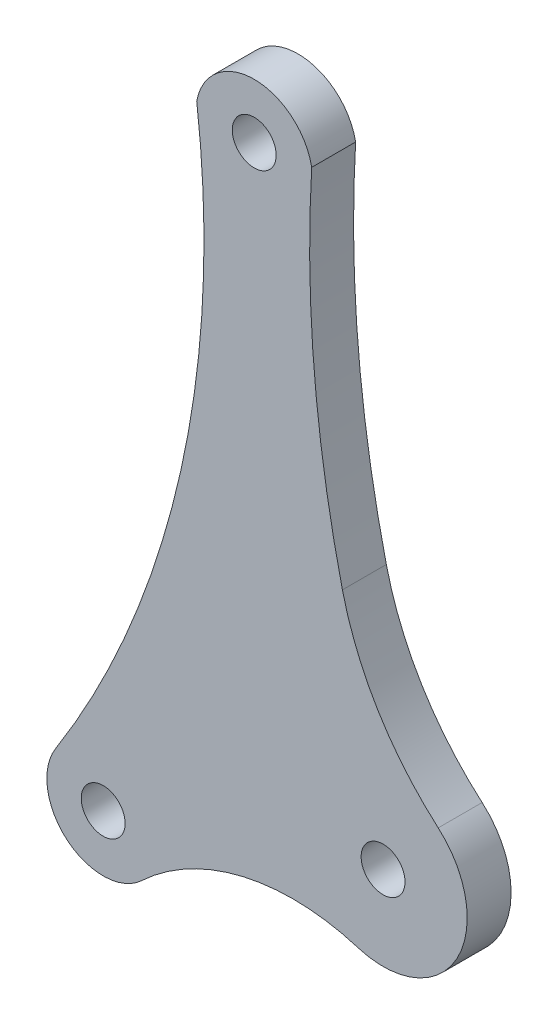
ISO-10303-21;
HEADER;
FILE_DESCRIPTION(('STEP AP214'),'2;1');
FILE_NAME('part.step','',(''),(''),'','','');
FILE_SCHEMA(('AUTOMOTIVE_DESIGN { 1 0 10303 214 1 1 1 1 }'));
ENDSEC;
DATA;
#1=APPLICATION_CONTEXT('core data for automotive mechanical design processes');
#2=APPLICATION_PROTOCOL_DEFINITION('international standard','automotive_design',2000,#1);
#3=PRODUCT_CONTEXT('',#1,'mechanical');
#4=PRODUCT('Part','Part','',(#3));
#5=PRODUCT_RELATED_PRODUCT_CATEGORY('part','',(#4));
#6=PRODUCT_DEFINITION_FORMATION('','',#4);
#7=PRODUCT_DEFINITION_CONTEXT('part definition',#1,'design');
#8=PRODUCT_DEFINITION('design','',#6,#7);
#9=PRODUCT_DEFINITION_SHAPE('','',#8);
#10=(LENGTH_UNIT() NAMED_UNIT(*) SI_UNIT(.MILLI.,.METRE.));
#11=(NAMED_UNIT(*) PLANE_ANGLE_UNIT() SI_UNIT($,.RADIAN.));
#12=(NAMED_UNIT(*) SI_UNIT($,.STERADIAN.) SOLID_ANGLE_UNIT());
#13=UNCERTAINTY_MEASURE_WITH_UNIT(LENGTH_MEASURE(1.E-05),#10,'distance_accuracy_value','');
#14=(GEOMETRIC_REPRESENTATION_CONTEXT(3) GLOBAL_UNCERTAINTY_ASSIGNED_CONTEXT((#13)) GLOBAL_UNIT_ASSIGNED_CONTEXT((#10,
#11,#12)) REPRESENTATION_CONTEXT('',''));
#15=CARTESIAN_POINT('',(0.,0.,0.));
#16=DIRECTION('',(0.,0.,1.));
#17=DIRECTION('',(1.,0.,0.));
#18=AXIS2_PLACEMENT_3D('',#15,#16,#17);
#19=CARTESIAN_POINT('',(1201.72344264431,1445.55749163267,-3.));
#20=DIRECTION('',(0.,0.,1.));
#21=DIRECTION('',(1.,0.,0.));
#22=AXIS2_PLACEMENT_3D('',#19,#20,#21);
#23=CYLINDRICAL_SURFACE('',#22,65.7002973868371);
#24=CARTESIAN_POINT('',(1201.72344264431,1445.55749163267,0.));
#25=DIRECTION('',(0.,0.,-1.));
#26=DIRECTION('',(-1.,0.,0.));
#27=AXIS2_PLACEMENT_3D('',#24,#25,#26);
#28=CIRCLE('',#27,65.7002973868371);
#29=CARTESIAN_POINT('',(1266.9250454505,1453.63709980525,0.));
#30=VERTEX_POINT('',#29);
#31=CARTESIAN_POINT('',(1257.27880649141,1410.4842735805,0.));
#32=VERTEX_POINT('',#31);
#33=EDGE_CURVE('E129',#30,#32,#28,.T.);
#34=ORIENTED_EDGE('',*,*,#33,.F.);
#35=DIRECTION('',(0.,0.,1.));
#36=VECTOR('',#35,1.);
#37=CARTESIAN_POINT('',(1266.9250454505,1453.63709980525,-3.));
#38=LINE('',#37,#36);
#39=CARTESIAN_POINT('',(1266.9250454505,1453.63709980525,-3.));
#40=VERTEX_POINT('',#39);
#41=EDGE_CURVE('E11',#40,#30,#38,.T.);
#42=ORIENTED_EDGE('',*,*,#41,.F.);
#43=CARTESIAN_POINT('',(1201.72344264431,1445.55749163267,-3.));
#44=DIRECTION('',(0.,0.,-1.));
#45=DIRECTION('',(-1.,0.,0.));
#46=AXIS2_PLACEMENT_3D('',#43,#44,#45);
#47=CIRCLE('',#46,65.7002973868371);
#48=CARTESIAN_POINT('',(1257.27880649141,1410.4842735805,-3.));
#49=VERTEX_POINT('',#48);
#50=EDGE_CURVE('E147',#40,#49,#47,.T.);
#51=ORIENTED_EDGE('',*,*,#50,.T.);
#52=DIRECTION('',(0.,0.,1.));
#53=VECTOR('',#52,1.);
#54=CARTESIAN_POINT('',(1257.27880649141,1410.4842735805,-3.));
#55=LINE('',#54,#53);
#56=EDGE_CURVE('E41',#49,#32,#55,.T.);
#57=ORIENTED_EDGE('',*,*,#56,.T.);
#58=EDGE_LOOP('',(#34,#42,#51,#57));
#59=FACE_BOUND('',#58,.T.);
#60=ADVANCED_FACE('F38',(#59),#23,.F.);
#61=CARTESIAN_POINT('',(1270.85385847165,1452.88581540847,-3.));
#62=DIRECTION('',(0.,0.,1.));
#63=DIRECTION('',(1.,0.,0.));
#64=AXIS2_PLACEMENT_3D('',#61,#62,#63);
#65=CYLINDRICAL_SURFACE('',#64,3.99999999999996);
#66=CARTESIAN_POINT('',(1270.85385847165,1452.88581540847,0.));
#67=DIRECTION('',(0.,0.,1.));
#68=DIRECTION('',(-1.,0.,0.));
#69=AXIS2_PLACEMENT_3D('',#66,#67,#68);
#70=CIRCLE('',#69,3.99999999999996);
#71=CARTESIAN_POINT('',(1274.7826714928,1453.63709980525,0.));
#72=VERTEX_POINT('',#71);
#73=EDGE_CURVE('E145',#72,#30,#70,.T.);
#74=ORIENTED_EDGE('',*,*,#73,.F.);
#75=DIRECTION('',(0.,0.,1.));
#76=VECTOR('',#75,1.);
#77=CARTESIAN_POINT('',(1274.7826714928,1453.63709980525,-3.));
#78=LINE('',#77,#76);
#79=CARTESIAN_POINT('',(1274.7826714928,1453.63709980525,-3.));
#80=VERTEX_POINT('',#79);
#81=EDGE_CURVE('E47',#80,#72,#78,.T.);
#82=ORIENTED_EDGE('',*,*,#81,.F.);
#83=CARTESIAN_POINT('',(1270.85385847165,1452.88581540847,-3.));
#84=DIRECTION('',(0.,0.,1.));
#85=DIRECTION('',(-1.,0.,0.));
#86=AXIS2_PLACEMENT_3D('',#83,#84,#85);
#87=CIRCLE('',#86,3.99999999999996);
#88=EDGE_CURVE('E119',#80,#40,#87,.T.);
#89=ORIENTED_EDGE('',*,*,#88,.T.);
#90=ORIENTED_EDGE('',*,*,#41,.T.);
#91=EDGE_LOOP('',(#74,#82,#89,#90));
#92=FACE_BOUND('',#91,.T.);
#93=ADVANCED_FACE('F157',(#92),#65,.T.);
#94=CARTESIAN_POINT('',(1357.48955434481,1448.81843434177,-3.));
#95=DIRECTION('',(0.,0.,1.));
#96=DIRECTION('',(1.,0.,0.));
#97=AXIS2_PLACEMENT_3D('',#94,#95,#96);
#98=CYLINDRICAL_SURFACE('',#97,82.8471363895233);
#99=CARTESIAN_POINT('',(1357.48955434481,1448.81843434177,0.));
#100=DIRECTION('',(0.,0.,-1.));
#101=DIRECTION('',(1.,0.,0.));
#102=AXIS2_PLACEMENT_3D('',#99,#100,#101);
#103=CIRCLE('',#102,82.8471363895233);
#104=CARTESIAN_POINT('',(1276.88234074241,1429.68403800425,0.));
#105=VERTEX_POINT('',#104);
#106=EDGE_CURVE('E106',#105,#72,#103,.T.);
#107=ORIENTED_EDGE('',*,*,#106,.F.);
#108=DIRECTION('',(0.,0.,1.));
#109=VECTOR('',#108,1.);
#110=CARTESIAN_POINT('',(1276.88234074241,1429.68403800425,-3.));
#111=LINE('',#110,#109);
#112=CARTESIAN_POINT('',(1276.88234074241,1429.68403800425,-3.));
#113=VERTEX_POINT('',#112);
#114=EDGE_CURVE('E101',#113,#105,#111,.T.);
#115=ORIENTED_EDGE('',*,*,#114,.F.);
#116=CARTESIAN_POINT('',(1357.48955434481,1448.81843434177,-3.));
#117=DIRECTION('',(0.,0.,-1.));
#118=DIRECTION('',(1.,0.,0.));
#119=AXIS2_PLACEMENT_3D('',#116,#117,#118);
#120=CIRCLE('',#119,82.8471363895233);
#121=EDGE_CURVE('E104',#113,#80,#120,.T.);
#122=ORIENTED_EDGE('',*,*,#121,.T.);
#123=ORIENTED_EDGE('',*,*,#81,.T.);
#124=EDGE_LOOP('',(#107,#115,#122,#123));
#125=FACE_BOUND('',#124,.T.);
#126=ADVANCED_FACE('F103',(#125),#98,.F.);
#127=CARTESIAN_POINT('',(1296.95583988,1434.44904936259,-3.));
#128=DIRECTION('',(0.,0.,1.));
#129=DIRECTION('',(1.,0.,0.));
#130=AXIS2_PLACEMENT_3D('',#127,#128,#129);
#131=CYLINDRICAL_SURFACE('',#130,20.6313039062567);
#132=CARTESIAN_POINT('',(1296.95583988,1434.44904936259,0.));
#133=DIRECTION('',(0.,0.,-1.));
#134=DIRECTION('',(1.,0.,0.));
#135=AXIS2_PLACEMENT_3D('',#132,#133,#134);
#136=CIRCLE('',#135,20.6313039062567);
#137=CARTESIAN_POINT('',(1283.4296829653,1418.87041720212,0.));
#138=VERTEX_POINT('',#137);
#139=EDGE_CURVE('E142',#138,#105,#136,.T.);
#140=ORIENTED_EDGE('',*,*,#139,.F.);
#141=DIRECTION('',(0.,0.,1.));
#142=VECTOR('',#141,1.);
#143=CARTESIAN_POINT('',(1283.4296829653,1418.87041720212,-3.));
#144=LINE('',#143,#142);
#145=CARTESIAN_POINT('',(1283.4296829653,1418.87041720212,-3.));
#146=VERTEX_POINT('',#145);
#147=EDGE_CURVE('E111',#146,#138,#144,.T.);
#148=ORIENTED_EDGE('',*,*,#147,.F.);
#149=CARTESIAN_POINT('',(1296.95583988,1434.44904936259,-3.));
#150=DIRECTION('',(0.,0.,-1.));
#151=DIRECTION('',(1.,0.,0.));
#152=AXIS2_PLACEMENT_3D('',#149,#150,#151);
#153=CIRCLE('',#152,20.6313039062567);
#154=EDGE_CURVE('E117',#146,#113,#153,.T.);
#155=ORIENTED_EDGE('',*,*,#154,.T.);
#156=ORIENTED_EDGE('',*,*,#114,.T.);
#157=EDGE_LOOP('',(#140,#148,#155,#156));
#158=FACE_BOUND('',#157,.T.);
#159=ADVANCED_FACE('F121',(#158),#131,.F.);
#160=CARTESIAN_POINT('',(1279.65990658021,1414.52861043461,-3.));
#161=DIRECTION('',(0.,0.,1.));
#162=DIRECTION('',(1.,0.,0.));
#163=AXIS2_PLACEMENT_3D('',#160,#161,#162);
#164=CYLINDRICAL_SURFACE('',#163,5.75000000000008);
#165=CARTESIAN_POINT('',(1279.65990658021,1414.52861043461,0.));
#166=DIRECTION('',(0.,0.,1.));
#167=DIRECTION('',(1.,0.,0.));
#168=AXIS2_PLACEMENT_3D('',#165,#166,#167);
#169=CIRCLE('',#168,5.75000000000008);
#170=CARTESIAN_POINT('',(1277.9651340676,1409.03404528981,0.));
#171=VERTEX_POINT('',#170);
#172=EDGE_CURVE('E139',#171,#138,#169,.T.);
#173=ORIENTED_EDGE('',*,*,#172,.F.);
#174=DIRECTION('',(0.,0.,1.));
#175=VECTOR('',#174,1.);
#176=CARTESIAN_POINT('',(1277.9651340676,1409.03404528981,-3.));
#177=LINE('',#176,#175);
#178=CARTESIAN_POINT('',(1277.9651340676,1409.03404528981,-3.));
#179=VERTEX_POINT('',#178);
#180=EDGE_CURVE('E151',#179,#171,#177,.T.);
#181=ORIENTED_EDGE('',*,*,#180,.F.);
#182=CARTESIAN_POINT('',(1279.65990658021,1414.52861043461,-3.));
#183=DIRECTION('',(0.,0.,1.));
#184=DIRECTION('',(1.,0.,0.));
#185=AXIS2_PLACEMENT_3D('',#182,#183,#184);
#186=CIRCLE('',#185,5.75000000000008);
#187=EDGE_CURVE('E122',#179,#146,#186,.T.);
#188=ORIENTED_EDGE('',*,*,#187,.T.);
#189=ORIENTED_EDGE('',*,*,#147,.T.);
#190=EDGE_LOOP('',(#173,#181,#188,#189));
#191=FACE_BOUND('',#190,.T.);
#192=ADVANCED_FACE('F170',(#191),#164,.T.);
#193=CARTESIAN_POINT('',(1273.5069580235,1394.58034220032,-3.));
#194=DIRECTION('',(0.,0.,1.));
#195=DIRECTION('',(1.,0.,0.));
#196=AXIS2_PLACEMENT_3D('',#193,#194,#195);
#197=CYLINDRICAL_SURFACE('',#196,15.1256360738781);
#198=CARTESIAN_POINT('',(1273.5069580235,1394.58034220032,0.));
#199=DIRECTION('',(0.,0.,-1.));
#200=DIRECTION('',(-1.,0.,0.));
#201=AXIS2_PLACEMENT_3D('',#198,#199,#200);
#202=CIRCLE('',#201,15.1256360738781);
#203=CARTESIAN_POINT('',(1263.16636055814,1405.61922396881,0.));
#204=VERTEX_POINT('',#203);
#205=EDGE_CURVE('E136',#204,#171,#202,.T.);
#206=ORIENTED_EDGE('',*,*,#205,.F.);
#207=DIRECTION('',(0.,0.,1.));
#208=VECTOR('',#207,1.);
#209=CARTESIAN_POINT('',(1263.16636055814,1405.61922396881,-3.));
#210=LINE('',#209,#208);
#211=CARTESIAN_POINT('',(1263.16636055814,1405.61922396881,-3.));
#212=VERTEX_POINT('',#211);
#213=EDGE_CURVE('E152',#212,#204,#210,.T.);
#214=ORIENTED_EDGE('',*,*,#213,.F.);
#215=CARTESIAN_POINT('',(1273.5069580235,1394.58034220032,-3.));
#216=DIRECTION('',(0.,0.,-1.));
#217=DIRECTION('',(-1.,0.,0.));
#218=AXIS2_PLACEMENT_3D('',#215,#216,#217);
#219=CIRCLE('',#218,15.1256360738781);
#220=EDGE_CURVE('E124',#212,#179,#219,.T.);
#221=ORIENTED_EDGE('',*,*,#220,.T.);
#222=ORIENTED_EDGE('',*,*,#180,.T.);
#223=EDGE_LOOP('',(#206,#214,#221,#222));
#224=FACE_BOUND('',#223,.T.);
#225=ADVANCED_FACE('F173',(#224),#197,.F.);
#226=CARTESIAN_POINT('',(1260.53431916515,1408.42900298248,-3.));
#227=DIRECTION('',(0.,0.,1.));
#228=DIRECTION('',(1.,0.,0.));
#229=AXIS2_PLACEMENT_3D('',#226,#227,#228);
#230=CYLINDRICAL_SURFACE('',#229,3.85000000000001);
#231=CARTESIAN_POINT('',(1260.53431916515,1408.42900298248,0.));
#232=DIRECTION('',(0.,0.,1.));
#233=DIRECTION('',(1.,0.,0.));
#234=AXIS2_PLACEMENT_3D('',#231,#232,#233);
#235=CIRCLE('',#234,3.85000000000001);
#236=EDGE_CURVE('E132',#32,#204,#235,.T.);
#237=ORIENTED_EDGE('',*,*,#236,.F.);
#238=ORIENTED_EDGE('',*,*,#56,.F.);
#239=CARTESIAN_POINT('',(1260.53431916515,1408.42900298248,-3.));
#240=DIRECTION('',(0.,0.,1.));
#241=DIRECTION('',(1.,0.,0.));
#242=AXIS2_PLACEMENT_3D('',#239,#240,#241);
#243=CIRCLE('',#242,3.85000000000001);
#244=EDGE_CURVE('E223',#49,#212,#243,.T.);
#245=ORIENTED_EDGE('',*,*,#244,.T.);
#246=ORIENTED_EDGE('',*,*,#213,.T.);
#247=EDGE_LOOP('',(#237,#238,#245,#246));
#248=FACE_BOUND('',#247,.T.);
#249=ADVANCED_FACE('F154',(#248),#230,.T.);
#250=CARTESIAN_POINT('',(1231.12888090473,1426.99324730758,-3.));
#251=DIRECTION('',(0.,0.,-1.));
#252=DIRECTION('',(-1.,0.,0.));
#253=AXIS2_PLACEMENT_3D('',#250,#251,#252);
#254=PLANE('',#253);
#255=CARTESIAN_POINT('',(1270.85529947518,1453.1378822961,-3.));
#256=DIRECTION('',(0.,0.,1.));
#257=DIRECTION('',(1.,0.,0.));
#258=AXIS2_PLACEMENT_3D('',#255,#256,#257);
#259=CIRCLE('',#258,1.50000000000011);
#260=CARTESIAN_POINT('',(1272.35529947518,1453.1378822961,-3.));
#261=VERTEX_POINT('',#260);
#262=EDGE_CURVE('E204',#261,#261,#259,.T.);
#263=ORIENTED_EDGE('',*,*,#262,.T.);
#264=EDGE_LOOP('',(#263));
#265=FACE_BOUND('',#264,.T.);
#266=CARTESIAN_POINT('',(1260.53431916515,1408.42900298248,-3.));
#267=DIRECTION('',(0.,0.,1.));
#268=DIRECTION('',(1.,0.,0.));
#269=AXIS2_PLACEMENT_3D('',#266,#267,#268);
#270=CIRCLE('',#269,1.50000000000011);
#271=CARTESIAN_POINT('',(1262.03431916515,1408.42900298248,-3.));
#272=VERTEX_POINT('',#271);
#273=EDGE_CURVE('E212',#272,#272,#270,.T.);
#274=ORIENTED_EDGE('',*,*,#273,.T.);
#275=EDGE_LOOP('',(#274));
#276=FACE_BOUND('',#275,.T.);
#277=CARTESIAN_POINT('',(1279.65990658021,1414.52861043461,-3.));
#278=DIRECTION('',(0.,0.,1.));
#279=DIRECTION('',(1.,0.,0.));
#280=AXIS2_PLACEMENT_3D('',#277,#278,#279);
#281=CIRCLE('',#280,1.50000000000011);
#282=CARTESIAN_POINT('',(1281.15990658021,1414.52861043461,-3.));
#283=VERTEX_POINT('',#282);
#284=EDGE_CURVE('E133',#283,#283,#281,.T.);
#285=ORIENTED_EDGE('',*,*,#284,.T.);
#286=EDGE_LOOP('',(#285));
#287=FACE_BOUND('',#286,.T.);
#288=ORIENTED_EDGE('',*,*,#50,.F.);
#289=ORIENTED_EDGE('',*,*,#88,.F.);
#290=ORIENTED_EDGE('',*,*,#121,.F.);
#291=ORIENTED_EDGE('',*,*,#154,.F.);
#292=ORIENTED_EDGE('',*,*,#187,.F.);
#293=ORIENTED_EDGE('',*,*,#220,.F.);
#294=ORIENTED_EDGE('',*,*,#244,.F.);
#295=EDGE_LOOP('',(#288,#289,#290,#291,#292,#293,#294));
#296=FACE_BOUND('',#295,.T.);
#297=ADVANCED_FACE('F115',(#265,#276,#287,#296),#254,.T.);
#298=CARTESIAN_POINT('',(1231.12888090473,1426.99324730758,0.));
#299=DIRECTION('',(0.,0.,-1.));
#300=DIRECTION('',(-1.,0.,0.));
#301=AXIS2_PLACEMENT_3D('',#298,#299,#300);
#302=PLANE('',#301);
#303=CARTESIAN_POINT('',(1270.85529947518,1453.1378822961,0.));
#304=DIRECTION('',(0.,0.,1.));
#305=DIRECTION('',(1.,0.,0.));
#306=AXIS2_PLACEMENT_3D('',#303,#304,#305);
#307=CIRCLE('',#306,1.50000000000011);
#308=CARTESIAN_POINT('',(1272.35529947518,1453.1378822961,0.));
#309=VERTEX_POINT('',#308);
#310=EDGE_CURVE('E207',#309,#309,#307,.T.);
#311=ORIENTED_EDGE('',*,*,#310,.F.);
#312=EDGE_LOOP('',(#311));
#313=FACE_BOUND('',#312,.T.);
#314=CARTESIAN_POINT('',(1260.53431916515,1408.42900298248,0.));
#315=DIRECTION('',(0.,0.,1.));
#316=DIRECTION('',(1.,0.,0.));
#317=AXIS2_PLACEMENT_3D('',#314,#315,#316);
#318=CIRCLE('',#317,1.50000000000011);
#319=CARTESIAN_POINT('',(1262.03431916515,1408.42900298248,0.));
#320=VERTEX_POINT('',#319);
#321=EDGE_CURVE('E209',#320,#320,#318,.T.);
#322=ORIENTED_EDGE('',*,*,#321,.F.);
#323=EDGE_LOOP('',(#322));
#324=FACE_BOUND('',#323,.T.);
#325=CARTESIAN_POINT('',(1279.65990658021,1414.52861043461,0.));
#326=DIRECTION('',(0.,0.,1.));
#327=DIRECTION('',(1.,0.,0.));
#328=AXIS2_PLACEMENT_3D('',#325,#326,#327);
#329=CIRCLE('',#328,1.50000000000011);
#330=CARTESIAN_POINT('',(1281.15990658021,1414.52861043461,0.));
#331=VERTEX_POINT('',#330);
#332=EDGE_CURVE('E215',#331,#331,#329,.T.);
#333=ORIENTED_EDGE('',*,*,#332,.F.);
#334=EDGE_LOOP('',(#333));
#335=FACE_BOUND('',#334,.T.);
#336=ORIENTED_EDGE('',*,*,#33,.T.);
#337=ORIENTED_EDGE('',*,*,#236,.T.);
#338=ORIENTED_EDGE('',*,*,#205,.T.);
#339=ORIENTED_EDGE('',*,*,#172,.T.);
#340=ORIENTED_EDGE('',*,*,#139,.T.);
#341=ORIENTED_EDGE('',*,*,#106,.T.);
#342=ORIENTED_EDGE('',*,*,#73,.T.);
#343=EDGE_LOOP('',(#336,#337,#338,#339,#340,#341,#342));
#344=FACE_BOUND('',#343,.T.);
#345=ADVANCED_FACE('F156',(#313,#324,#335,#344),#302,.F.);
#346=CARTESIAN_POINT('',(1279.65990658021,1414.52861043461,-3.));
#347=DIRECTION('',(0.,0.,1.));
#348=DIRECTION('',(1.,0.,0.));
#349=AXIS2_PLACEMENT_3D('',#346,#347,#348);
#350=CYLINDRICAL_SURFACE('',#349,1.50000000000011);
#351=ORIENTED_EDGE('',*,*,#284,.F.);
#352=EDGE_LOOP('',(#351));
#353=FACE_BOUND('',#352,.T.);
#354=ORIENTED_EDGE('',*,*,#332,.T.);
#355=EDGE_LOOP('',(#354));
#356=FACE_BOUND('',#355,.T.);
#357=ADVANCED_FACE('F185',(#353,#356),#350,.F.);
#358=CARTESIAN_POINT('',(1260.53431916515,1408.42900298248,-3.));
#359=DIRECTION('',(0.,0.,1.));
#360=DIRECTION('',(1.,0.,0.));
#361=AXIS2_PLACEMENT_3D('',#358,#359,#360);
#362=CYLINDRICAL_SURFACE('',#361,1.50000000000011);
#363=ORIENTED_EDGE('',*,*,#273,.F.);
#364=EDGE_LOOP('',(#363));
#365=FACE_BOUND('',#364,.T.);
#366=ORIENTED_EDGE('',*,*,#321,.T.);
#367=EDGE_LOOP('',(#366));
#368=FACE_BOUND('',#367,.T.);
#369=ADVANCED_FACE('F192',(#365,#368),#362,.F.);
#370=CARTESIAN_POINT('',(1270.85529947518,1453.1378822961,-3.));
#371=DIRECTION('',(0.,0.,1.));
#372=DIRECTION('',(1.,0.,0.));
#373=AXIS2_PLACEMENT_3D('',#370,#371,#372);
#374=CYLINDRICAL_SURFACE('',#373,1.50000000000011);
#375=ORIENTED_EDGE('',*,*,#262,.F.);
#376=EDGE_LOOP('',(#375));
#377=FACE_BOUND('',#376,.T.);
#378=ORIENTED_EDGE('',*,*,#310,.T.);
#379=EDGE_LOOP('',(#378));
#380=FACE_BOUND('',#379,.T.);
#381=ADVANCED_FACE('F196',(#377,#380),#374,.F.);
#382=CLOSED_SHELL('',(#60,#93,#126,#159,#192,#225,#249,#297,#345,#357,#369,#381));
#383=MANIFOLD_SOLID_BREP('B2',#382);
#384=ADVANCED_BREP_SHAPE_REPRESENTATION('',(#18,#383),#14);
#385=SHAPE_DEFINITION_REPRESENTATION(#9,#384);
ENDSEC;
END-ISO-10303-21;
